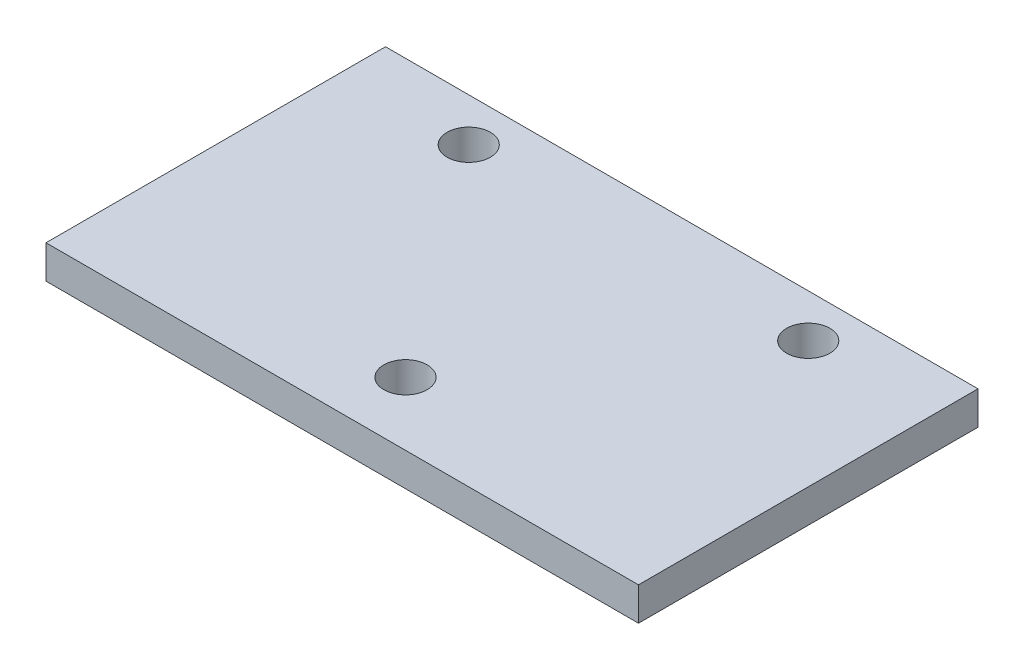
ISO-10303-21;
HEADER;
FILE_DESCRIPTION(('STEP AP214'),'2;1');
FILE_NAME('part.step','',(''),(''),'','','');
FILE_SCHEMA(('AUTOMOTIVE_DESIGN { 1 0 10303 214 1 1 1 1 }'));
ENDSEC;
DATA;
#1=APPLICATION_CONTEXT('core data for automotive mechanical design processes');
#2=APPLICATION_PROTOCOL_DEFINITION('international standard','automotive_design',2000,#1);
#3=PRODUCT_CONTEXT('',#1,'mechanical');
#4=PRODUCT('Part','Part','',(#3));
#5=PRODUCT_RELATED_PRODUCT_CATEGORY('part','',(#4));
#6=PRODUCT_DEFINITION_FORMATION('','',#4);
#7=PRODUCT_DEFINITION_CONTEXT('part definition',#1,'design');
#8=PRODUCT_DEFINITION('design','',#6,#7);
#9=PRODUCT_DEFINITION_SHAPE('','',#8);
#10=(LENGTH_UNIT() NAMED_UNIT(*) SI_UNIT(.MILLI.,.METRE.));
#11=(NAMED_UNIT(*) PLANE_ANGLE_UNIT() SI_UNIT($,.RADIAN.));
#12=(NAMED_UNIT(*) SI_UNIT($,.STERADIAN.) SOLID_ANGLE_UNIT());
#13=UNCERTAINTY_MEASURE_WITH_UNIT(LENGTH_MEASURE(1.E-05),#10,'distance_accuracy_value','');
#14=(GEOMETRIC_REPRESENTATION_CONTEXT(3) GLOBAL_UNCERTAINTY_ASSIGNED_CONTEXT((#13)) GLOBAL_UNIT_ASSIGNED_CONTEXT((#10,
#11,#12)) REPRESENTATION_CONTEXT('',''));
#15=CARTESIAN_POINT('',(0.,0.,0.));
#16=DIRECTION('',(0.,0.,1.));
#17=DIRECTION('',(1.,0.,0.));
#18=AXIS2_PLACEMENT_3D('',#15,#16,#17);
#19=CARTESIAN_POINT('',(-89.,10.,51.));
#20=DIRECTION('',(-1.,0.,0.));
#21=DIRECTION('',(0.,0.,1.));
#22=AXIS2_PLACEMENT_3D('',#19,#20,#21);
#23=PLANE('',#22);
#24=DIRECTION('',(0.,0.,-1.));
#25=VECTOR('',#24,1.);
#26=CARTESIAN_POINT('',(-89.,0.,51.));
#27=LINE('',#26,#25);
#28=CARTESIAN_POINT('',(-89.,0.,51.));
#29=VERTEX_POINT('',#28);
#30=CARTESIAN_POINT('',(-89.,0.,-51.));
#31=VERTEX_POINT('',#30);
#32=EDGE_CURVE('E98',#29,#31,#27,.T.);
#33=ORIENTED_EDGE('',*,*,#32,.F.);
#34=DIRECTION('',(0.,-1.,0.));
#35=VECTOR('',#34,1.);
#36=CARTESIAN_POINT('',(-89.,10.,51.));
#37=LINE('',#36,#35);
#38=CARTESIAN_POINT('',(-89.,10.,51.));
#39=VERTEX_POINT('',#38);
#40=EDGE_CURVE('E11',#39,#29,#37,.T.);
#41=ORIENTED_EDGE('',*,*,#40,.F.);
#42=DIRECTION('',(0.,0.,-1.));
#43=VECTOR('',#42,1.);
#44=CARTESIAN_POINT('',(-89.,10.,51.));
#45=LINE('',#44,#43);
#46=CARTESIAN_POINT('',(-89.,10.,-51.));
#47=VERTEX_POINT('',#46);
#48=EDGE_CURVE('E90',#39,#47,#45,.T.);
#49=ORIENTED_EDGE('',*,*,#48,.T.);
#50=DIRECTION('',(0.,-1.,0.));
#51=VECTOR('',#50,1.);
#52=CARTESIAN_POINT('',(-89.,10.,-51.));
#53=LINE('',#52,#51);
#54=EDGE_CURVE('E37',#47,#31,#53,.T.);
#55=ORIENTED_EDGE('',*,*,#54,.T.);
#56=EDGE_LOOP('',(#33,#41,#49,#55));
#57=FACE_BOUND('',#56,.T.);
#58=ADVANCED_FACE('F34',(#57),#23,.T.);
#59=CARTESIAN_POINT('',(-89.,10.,51.));
#60=DIRECTION('',(0.,0.,-1.));
#61=DIRECTION('',(-1.,0.,0.));
#62=AXIS2_PLACEMENT_3D('',#59,#60,#61);
#63=PLANE('',#62);
#64=DIRECTION('',(1.,0.,0.));
#65=VECTOR('',#64,1.);
#66=CARTESIAN_POINT('',(-89.,0.,51.));
#67=LINE('',#66,#65);
#68=CARTESIAN_POINT('',(89.,0.,51.));
#69=VERTEX_POINT('',#68);
#70=EDGE_CURVE('E105',#29,#69,#67,.T.);
#71=ORIENTED_EDGE('',*,*,#70,.T.);
#72=DIRECTION('',(0.,-1.,0.));
#73=VECTOR('',#72,1.);
#74=CARTESIAN_POINT('',(89.,10.,51.));
#75=LINE('',#74,#73);
#76=CARTESIAN_POINT('',(89.,10.,51.));
#77=VERTEX_POINT('',#76);
#78=EDGE_CURVE('E43',#77,#69,#75,.T.);
#79=ORIENTED_EDGE('',*,*,#78,.F.);
#80=DIRECTION('',(1.,0.,0.));
#81=VECTOR('',#80,1.);
#82=CARTESIAN_POINT('',(-89.,10.,51.));
#83=LINE('',#82,#81);
#84=EDGE_CURVE('E93',#39,#77,#83,.T.);
#85=ORIENTED_EDGE('',*,*,#84,.F.);
#86=ORIENTED_EDGE('',*,*,#40,.T.);
#87=EDGE_LOOP('',(#71,#79,#85,#86));
#88=FACE_BOUND('',#87,.T.);
#89=ADVANCED_FACE('F156',(#88),#63,.F.);
#90=CARTESIAN_POINT('',(89.,10.,-51.));
#91=DIRECTION('',(1.,0.,0.));
#92=DIRECTION('',(0.,0.,-1.));
#93=AXIS2_PLACEMENT_3D('',#90,#91,#92);
#94=PLANE('',#93);
#95=DIRECTION('',(0.,0.,1.));
#96=VECTOR('',#95,1.);
#97=CARTESIAN_POINT('',(89.,0.,-51.));
#98=LINE('',#97,#96);
#99=CARTESIAN_POINT('',(89.,0.,-51.));
#100=VERTEX_POINT('',#99);
#101=EDGE_CURVE('E85',#100,#69,#98,.T.);
#102=ORIENTED_EDGE('',*,*,#101,.F.);
#103=DIRECTION('',(0.,-1.,0.));
#104=VECTOR('',#103,1.);
#105=CARTESIAN_POINT('',(89.,10.,-51.));
#106=LINE('',#105,#104);
#107=CARTESIAN_POINT('',(89.,10.,-51.));
#108=VERTEX_POINT('',#107);
#109=EDGE_CURVE('E81',#108,#100,#106,.T.);
#110=ORIENTED_EDGE('',*,*,#109,.F.);
#111=DIRECTION('',(0.,0.,1.));
#112=VECTOR('',#111,1.);
#113=CARTESIAN_POINT('',(89.,10.,-51.));
#114=LINE('',#113,#112);
#115=EDGE_CURVE('E83',#108,#77,#114,.T.);
#116=ORIENTED_EDGE('',*,*,#115,.T.);
#117=ORIENTED_EDGE('',*,*,#78,.T.);
#118=EDGE_LOOP('',(#102,#110,#116,#117));
#119=FACE_BOUND('',#118,.T.);
#120=ADVANCED_FACE('F82',(#119),#94,.T.);
#121=CARTESIAN_POINT('',(89.,10.,-51.));
#122=DIRECTION('',(0.,0.,1.));
#123=DIRECTION('',(1.,0.,0.));
#124=AXIS2_PLACEMENT_3D('',#121,#122,#123);
#125=PLANE('',#124);
#126=DIRECTION('',(-1.,0.,0.));
#127=VECTOR('',#126,1.);
#128=CARTESIAN_POINT('',(89.,0.,-51.));
#129=LINE('',#128,#127);
#130=EDGE_CURVE('E101',#100,#31,#129,.T.);
#131=ORIENTED_EDGE('',*,*,#130,.T.);
#132=ORIENTED_EDGE('',*,*,#54,.F.);
#133=DIRECTION('',(-1.,0.,0.));
#134=VECTOR('',#133,1.);
#135=CARTESIAN_POINT('',(89.,10.,-51.));
#136=LINE('',#135,#134);
#137=EDGE_CURVE('E78',#108,#47,#136,.T.);
#138=ORIENTED_EDGE('',*,*,#137,.F.);
#139=ORIENTED_EDGE('',*,*,#109,.T.);
#140=EDGE_LOOP('',(#131,#132,#138,#139));
#141=FACE_BOUND('',#140,.T.);
#142=ADVANCED_FACE('F89',(#141),#125,.F.);
#143=CARTESIAN_POINT('',(-89.,10.,51.));
#144=DIRECTION('',(0.,-1.,0.));
#145=DIRECTION('',(0.,0.,-1.));
#146=AXIS2_PLACEMENT_3D('',#143,#144,#145);
#147=PLANE('',#146);
#148=CARTESIAN_POINT('',(0.,10.,32.));
#149=DIRECTION('',(0.,1.,0.));
#150=DIRECTION('',(0.,0.,1.));
#151=AXIS2_PLACEMENT_3D('',#148,#149,#150);
#152=CIRCLE('',#151,6.5);
#153=CARTESIAN_POINT('',(0.,10.,38.5));
#154=VERTEX_POINT('',#153);
#155=EDGE_CURVE('E120',#154,#154,#152,.T.);
#156=ORIENTED_EDGE('',*,*,#155,.F.);
#157=EDGE_LOOP('',(#156));
#158=FACE_BOUND('',#157,.T.);
#159=CARTESIAN_POINT('',(51.,10.,-38.));
#160=DIRECTION('',(0.,1.,0.));
#161=DIRECTION('',(0.,0.,1.));
#162=AXIS2_PLACEMENT_3D('',#159,#160,#161);
#163=CIRCLE('',#162,6.5);
#164=CARTESIAN_POINT('',(51.,10.,-31.5));
#165=VERTEX_POINT('',#164);
#166=EDGE_CURVE('E114',#165,#165,#163,.T.);
#167=ORIENTED_EDGE('',*,*,#166,.F.);
#168=EDGE_LOOP('',(#167));
#169=FACE_BOUND('',#168,.T.);
#170=CARTESIAN_POINT('',(-51.,10.,-38.));
#171=DIRECTION('',(0.,1.,0.));
#172=DIRECTION('',(0.,0.,1.));
#173=AXIS2_PLACEMENT_3D('',#170,#171,#172);
#174=CIRCLE('',#173,6.5);
#175=CARTESIAN_POINT('',(-51.,10.,-31.5));
#176=VERTEX_POINT('',#175);
#177=EDGE_CURVE('E108',#176,#176,#174,.T.);
#178=ORIENTED_EDGE('',*,*,#177,.F.);
#179=EDGE_LOOP('',(#178));
#180=FACE_BOUND('',#179,.T.);
#181=ORIENTED_EDGE('',*,*,#48,.F.);
#182=ORIENTED_EDGE('',*,*,#84,.T.);
#183=ORIENTED_EDGE('',*,*,#115,.F.);
#184=ORIENTED_EDGE('',*,*,#137,.T.);
#185=EDGE_LOOP('',(#181,#182,#183,#184));
#186=FACE_BOUND('',#185,.T.);
#187=ADVANCED_FACE('F92',(#158,#169,#180,#186),#147,.F.);
#188=CARTESIAN_POINT('',(-89.,0.,51.));
#189=DIRECTION('',(0.,-1.,0.));
#190=DIRECTION('',(0.,0.,-1.));
#191=AXIS2_PLACEMENT_3D('',#188,#189,#190);
#192=PLANE('',#191);
#193=CARTESIAN_POINT('',(0.,0.,32.));
#194=DIRECTION('',(0.,1.,0.));
#195=DIRECTION('',(0.,0.,1.));
#196=AXIS2_PLACEMENT_3D('',#193,#194,#195);
#197=CIRCLE('',#196,6.5);
#198=CARTESIAN_POINT('',(0.,0.,38.5));
#199=VERTEX_POINT('',#198);
#200=EDGE_CURVE('E117',#199,#199,#197,.T.);
#201=ORIENTED_EDGE('',*,*,#200,.T.);
#202=EDGE_LOOP('',(#201));
#203=FACE_BOUND('',#202,.T.);
#204=CARTESIAN_POINT('',(51.,0.,-38.));
#205=DIRECTION('',(0.,1.,0.));
#206=DIRECTION('',(0.,0.,1.));
#207=AXIS2_PLACEMENT_3D('',#204,#205,#206);
#208=CIRCLE('',#207,6.5);
#209=CARTESIAN_POINT('',(51.,0.,-31.5));
#210=VERTEX_POINT('',#209);
#211=EDGE_CURVE('E111',#210,#210,#208,.T.);
#212=ORIENTED_EDGE('',*,*,#211,.T.);
#213=EDGE_LOOP('',(#212));
#214=FACE_BOUND('',#213,.T.);
#215=CARTESIAN_POINT('',(-51.,0.,-38.));
#216=DIRECTION('',(0.,1.,0.));
#217=DIRECTION('',(0.,0.,1.));
#218=AXIS2_PLACEMENT_3D('',#215,#216,#217);
#219=CIRCLE('',#218,6.5);
#220=CARTESIAN_POINT('',(-51.,0.,-31.5));
#221=VERTEX_POINT('',#220);
#222=EDGE_CURVE('E102',#221,#221,#219,.T.);
#223=ORIENTED_EDGE('',*,*,#222,.T.);
#224=EDGE_LOOP('',(#223));
#225=FACE_BOUND('',#224,.T.);
#226=ORIENTED_EDGE('',*,*,#32,.T.);
#227=ORIENTED_EDGE('',*,*,#130,.F.);
#228=ORIENTED_EDGE('',*,*,#101,.T.);
#229=ORIENTED_EDGE('',*,*,#70,.F.);
#230=EDGE_LOOP('',(#226,#227,#228,#229));
#231=FACE_BOUND('',#230,.T.);
#232=ADVANCED_FACE('F126',(#203,#214,#225,#231),#192,.T.);
#233=CARTESIAN_POINT('',(-51.,0.,-38.));
#234=DIRECTION('',(0.,1.,0.));
#235=DIRECTION('',(0.,0.,1.));
#236=AXIS2_PLACEMENT_3D('',#233,#234,#235);
#237=CYLINDRICAL_SURFACE('',#236,6.5);
#238=ORIENTED_EDGE('',*,*,#222,.F.);
#239=EDGE_LOOP('',(#238));
#240=FACE_BOUND('',#239,.T.);
#241=ORIENTED_EDGE('',*,*,#177,.T.);
#242=EDGE_LOOP('',(#241));
#243=FACE_BOUND('',#242,.T.);
#244=ADVANCED_FACE('F143',(#240,#243),#237,.F.);
#245=CARTESIAN_POINT('',(51.,0.,-38.));
#246=DIRECTION('',(0.,1.,0.));
#247=DIRECTION('',(0.,0.,1.));
#248=AXIS2_PLACEMENT_3D('',#245,#246,#247);
#249=CYLINDRICAL_SURFACE('',#248,6.5);
#250=ORIENTED_EDGE('',*,*,#211,.F.);
#251=EDGE_LOOP('',(#250));
#252=FACE_BOUND('',#251,.T.);
#253=ORIENTED_EDGE('',*,*,#166,.T.);
#254=EDGE_LOOP('',(#253));
#255=FACE_BOUND('',#254,.T.);
#256=ADVANCED_FACE('F132',(#252,#255),#249,.F.);
#257=CARTESIAN_POINT('',(0.,0.,32.));
#258=DIRECTION('',(0.,1.,0.));
#259=DIRECTION('',(0.,0.,1.));
#260=AXIS2_PLACEMENT_3D('',#257,#258,#259);
#261=CYLINDRICAL_SURFACE('',#260,6.5);
#262=ORIENTED_EDGE('',*,*,#200,.F.);
#263=EDGE_LOOP('',(#262));
#264=FACE_BOUND('',#263,.T.);
#265=ORIENTED_EDGE('',*,*,#155,.T.);
#266=EDGE_LOOP('',(#265));
#267=FACE_BOUND('',#266,.T.);
#268=ADVANCED_FACE('F129',(#264,#267),#261,.F.);
#269=CLOSED_SHELL('',(#58,#89,#120,#142,#187,#232,#244,#256,#268));
#270=MANIFOLD_SOLID_BREP('B2',#269);
#271=ADVANCED_BREP_SHAPE_REPRESENTATION('',(#18,#270),#14);
#272=SHAPE_DEFINITION_REPRESENTATION(#9,#271);
ENDSEC;
END-ISO-10303-21;
